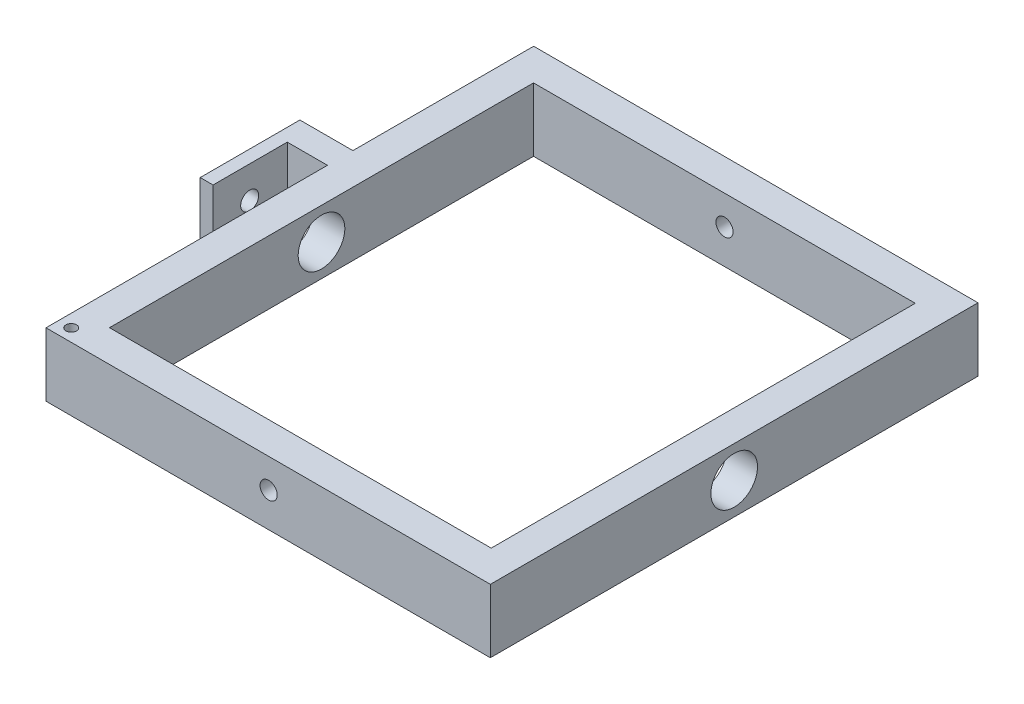
ISO-10303-21;
HEADER;
FILE_DESCRIPTION(('STEP AP214'),'2;1');
FILE_NAME('part.step','',(''),(''),'','','');
FILE_SCHEMA(('AUTOMOTIVE_DESIGN { 1 0 10303 214 1 1 1 1 }'));
ENDSEC;
DATA;
#1=APPLICATION_CONTEXT('core data for automotive mechanical design processes');
#2=APPLICATION_PROTOCOL_DEFINITION('international standard','automotive_design',2000,#1);
#3=PRODUCT_CONTEXT('',#1,'mechanical');
#4=PRODUCT('Part','Part','',(#3));
#5=PRODUCT_RELATED_PRODUCT_CATEGORY('part','',(#4));
#6=PRODUCT_DEFINITION_FORMATION('','',#4);
#7=PRODUCT_DEFINITION_CONTEXT('part definition',#1,'design');
#8=PRODUCT_DEFINITION('design','',#6,#7);
#9=PRODUCT_DEFINITION_SHAPE('','',#8);
#10=(LENGTH_UNIT() NAMED_UNIT(*) SI_UNIT(.MILLI.,.METRE.));
#11=(NAMED_UNIT(*) PLANE_ANGLE_UNIT() SI_UNIT($,.RADIAN.));
#12=(NAMED_UNIT(*) SI_UNIT($,.STERADIAN.) SOLID_ANGLE_UNIT());
#13=UNCERTAINTY_MEASURE_WITH_UNIT(LENGTH_MEASURE(1.E-05),#10,'distance_accuracy_value','');
#14=(GEOMETRIC_REPRESENTATION_CONTEXT(3) GLOBAL_UNCERTAINTY_ASSIGNED_CONTEXT((#13)) GLOBAL_UNIT_ASSIGNED_CONTEXT((#10,
#11,#12)) REPRESENTATION_CONTEXT('',''));
#15=CARTESIAN_POINT('',(0.,0.,0.));
#16=DIRECTION('',(0.,0.,1.));
#17=DIRECTION('',(1.,0.,0.));
#18=AXIS2_PLACEMENT_3D('',#15,#16,#17);
#19=CARTESIAN_POINT('',(-130.010419322355,30.,-17.7340118082441));
#20=DIRECTION('',(0.,0.,-1.));
#21=DIRECTION('',(0.,1.,0.));
#22=AXIS2_PLACEMENT_3D('',#19,#20,#21);
#23=PLANE('',#22);
#24=DIRECTION('',(1.,0.,0.));
#25=VECTOR('',#24,1.);
#26=CARTESIAN_POINT('',(-130.010419322355,30.,-17.7340118082441));
#27=LINE('',#26,#25);
#28=CARTESIAN_POINT('',(-123.949524665674,30.,-17.7340118082441));
#29=VERTEX_POINT('',#28);
#30=CARTESIAN_POINT('',(-105.010419322355,30.,-17.7340118082441));
#31=VERTEX_POINT('',#30);
#32=EDGE_CURVE('E134',#29,#31,#27,.T.);
#33=ORIENTED_EDGE('',*,*,#32,.F.);
#34=DIRECTION('',(0.,-1.,0.));
#35=VECTOR('',#34,1.);
#36=CARTESIAN_POINT('',(-123.949524665674,0.,-17.7340118082441));
#37=LINE('',#36,#35);
#38=CARTESIAN_POINT('',(-123.949524665674,0.,-17.7340118082441));
#39=VERTEX_POINT('',#38);
#40=EDGE_CURVE('E135',#29,#39,#37,.T.);
#41=ORIENTED_EDGE('',*,*,#40,.T.);
#42=DIRECTION('',(1.,0.,0.));
#43=VECTOR('',#42,1.);
#44=CARTESIAN_POINT('',(-130.010419322355,0.,-17.7340118082441));
#45=LINE('',#44,#43);
#46=CARTESIAN_POINT('',(-105.010419322355,0.,-17.7340118082441));
#47=VERTEX_POINT('',#46);
#48=EDGE_CURVE('E58',#39,#47,#45,.T.);
#49=ORIENTED_EDGE('',*,*,#48,.T.);
#50=DIRECTION('',(0.,1.,0.));
#51=VECTOR('',#50,1.);
#52=CARTESIAN_POINT('',(-105.010419322355,30.,-17.7340118082441));
#53=LINE('',#52,#51);
#54=EDGE_CURVE('E136',#47,#31,#53,.T.);
#55=ORIENTED_EDGE('',*,*,#54,.T.);
#56=EDGE_LOOP('',(#33,#41,#49,#55));
#57=FACE_BOUND('',#56,.T.);
#58=ADVANCED_FACE('F33',(#57),#23,.F.);
#59=CARTESIAN_POINT('',(-105.010419322355,30.,133.));
#60=DIRECTION('',(1.,0.,0.));
#61=DIRECTION('',(0.,0.,-1.));
#62=AXIS2_PLACEMENT_3D('',#59,#60,#61);
#63=PLANE('',#62);
#64=CARTESIAN_POINT('',(-105.010419322355,15.,0.));
#65=DIRECTION('',(1.,0.,0.));
#66=DIRECTION('',(0.,0.,-1.));
#67=AXIS2_PLACEMENT_3D('',#64,#65,#66);
#68=CIRCLE('',#67,11.);
#69=CARTESIAN_POINT('',(-105.010419322355,15.,11.));
#70=VERTEX_POINT('',#69);
#71=EDGE_CURVE('E192',#70,#70,#68,.F.);
#72=ORIENTED_EDGE('',*,*,#71,.F.);
#73=EDGE_LOOP('',(#72));
#74=FACE_BOUND('',#73,.T.);
#75=ORIENTED_EDGE('',*,*,#54,.F.);
#76=DIRECTION('',(0.,0.,-1.));
#77=VECTOR('',#76,1.);
#78=CARTESIAN_POINT('',(-105.010419322355,0.,133.));
#79=LINE('',#78,#77);
#80=CARTESIAN_POINT('',(-105.010419322355,0.,115.));
#81=VERTEX_POINT('',#80);
#82=EDGE_CURVE('E189',#81,#47,#79,.T.);
#83=ORIENTED_EDGE('',*,*,#82,.F.);
#84=DIRECTION('',(0.,-1.,0.));
#85=VECTOR('',#84,1.);
#86=CARTESIAN_POINT('',(-105.010419322355,30.,115.));
#87=LINE('',#86,#85);
#88=CARTESIAN_POINT('',(-105.010419322355,30.,115.));
#89=VERTEX_POINT('',#88);
#90=EDGE_CURVE('E196',#89,#81,#87,.T.);
#91=ORIENTED_EDGE('',*,*,#90,.F.);
#92=DIRECTION('',(0.,0.,-1.));
#93=VECTOR('',#92,1.);
#94=CARTESIAN_POINT('',(-105.010419322355,30.,133.));
#95=LINE('',#94,#93);
#96=EDGE_CURVE('E194',#89,#31,#95,.T.);
#97=ORIENTED_EDGE('',*,*,#96,.T.);
#98=EDGE_LOOP('',(#75,#83,#91,#97));
#99=FACE_BOUND('',#98,.T.);
#100=ADVANCED_FACE('F267',(#74,#99),#63,.F.);
#101=DIRECTION('',(0.,-1.,0.));
#102=VECTOR('',#101,1.);
#103=CARTESIAN_POINT('',(-105.010419322355,30.,-29.7394196250593));
#104=LINE('',#103,#102);
#105=CARTESIAN_POINT('',(-105.010419322355,30.,-29.7394196250593));
#106=VERTEX_POINT('',#105);
#107=CARTESIAN_POINT('',(-105.010419322355,0.,-29.7394196250593));
#108=VERTEX_POINT('',#107);
#109=EDGE_CURVE('E167',#106,#108,#104,.T.);
#110=ORIENTED_EDGE('',*,*,#109,.F.);
#111=CARTESIAN_POINT('',(-105.010419322355,30.,-115.));
#112=VERTEX_POINT('',#111);
#113=EDGE_CURVE('E188',#106,#112,#95,.T.);
#114=ORIENTED_EDGE('',*,*,#113,.T.);
#115=DIRECTION('',(0.,-1.,0.));
#116=VECTOR('',#115,1.);
#117=CARTESIAN_POINT('',(-105.010419322355,30.,-115.));
#118=LINE('',#117,#116);
#119=CARTESIAN_POINT('',(-105.010419322355,0.,-115.));
#120=VERTEX_POINT('',#119);
#121=EDGE_CURVE('E185',#112,#120,#118,.T.);
#122=ORIENTED_EDGE('',*,*,#121,.T.);
#123=EDGE_CURVE('E193',#108,#120,#79,.T.);
#124=ORIENTED_EDGE('',*,*,#123,.F.);
#125=EDGE_LOOP('',(#110,#114,#122,#124));
#126=FACE_BOUND('',#125,.T.);
#127=ADVANCED_FACE('F270',(#126),#63,.F.);
#128=CARTESIAN_POINT('',(-100.,30.,-100.));
#129=DIRECTION('',(0.,0.,1.));
#130=DIRECTION('',(1.,0.,0.));
#131=AXIS2_PLACEMENT_3D('',#128,#129,#130);
#132=PLANE('',#131);
#133=CARTESIAN_POINT('',(0.,16.1759191137221,-100.));
#134=DIRECTION('',(0.,0.,1.));
#135=DIRECTION('',(1.,0.,0.));
#136=AXIS2_PLACEMENT_3D('',#133,#134,#135);
#137=CIRCLE('',#136,4.04669054587853);
#138=CARTESIAN_POINT('',(4.04669054587853,16.1759191137221,-100.));
#139=VERTEX_POINT('',#138);
#140=EDGE_CURVE('E237',#139,#139,#137,.T.);
#141=ORIENTED_EDGE('',*,*,#140,.F.);
#142=EDGE_LOOP('',(#141));
#143=FACE_BOUND('',#142,.T.);
#144=DIRECTION('',(-1.,0.,0.));
#145=VECTOR('',#144,1.);
#146=CARTESIAN_POINT('',(-100.,30.,-100.));
#147=LINE('',#146,#145);
#148=CARTESIAN_POINT('',(89.971534855998,30.,-100.));
#149=VERTEX_POINT('',#148);
#150=CARTESIAN_POINT('',(-90.0799985312162,30.,-100.));
#151=VERTEX_POINT('',#150);
#152=EDGE_CURVE('E244',#149,#151,#147,.T.);
#153=ORIENTED_EDGE('',*,*,#152,.T.);
#154=DIRECTION('',(0.,-1.,0.));
#155=VECTOR('',#154,1.);
#156=CARTESIAN_POINT('',(-90.0799985312162,30.,-100.));
#157=LINE('',#156,#155);
#158=CARTESIAN_POINT('',(-90.0799985312162,0.,-100.));
#159=VERTEX_POINT('',#158);
#160=EDGE_CURVE('E219',#151,#159,#157,.T.);
#161=ORIENTED_EDGE('',*,*,#160,.T.);
#162=DIRECTION('',(-1.,0.,0.));
#163=VECTOR('',#162,1.);
#164=CARTESIAN_POINT('',(-100.,0.,-100.));
#165=LINE('',#164,#163);
#166=CARTESIAN_POINT('',(89.971534855998,0.,-100.));
#167=VERTEX_POINT('',#166);
#168=EDGE_CURVE('E243',#167,#159,#165,.T.);
#169=ORIENTED_EDGE('',*,*,#168,.F.);
#170=DIRECTION('',(0.,1.,0.));
#171=VECTOR('',#170,1.);
#172=CARTESIAN_POINT('',(89.971534855998,30.,-100.));
#173=LINE('',#172,#171);
#174=EDGE_CURVE('E231',#167,#149,#173,.T.);
#175=ORIENTED_EDGE('',*,*,#174,.T.);
#176=EDGE_LOOP('',(#153,#161,#169,#175));
#177=FACE_BOUND('',#176,.T.);
#178=ADVANCED_FACE('F358',(#143,#177),#132,.T.);
#179=CARTESIAN_POINT('',(-100.,30.,100.));
#180=DIRECTION('',(0.,0.,-1.));
#181=DIRECTION('',(-1.,0.,0.));
#182=AXIS2_PLACEMENT_3D('',#179,#180,#181);
#183=PLANE('',#182);
#184=CARTESIAN_POINT('',(0.,16.1759191137221,100.));
#185=DIRECTION('',(0.,0.,-1.));
#186=DIRECTION('',(-1.,0.,0.));
#187=AXIS2_PLACEMENT_3D('',#184,#185,#186);
#188=CIRCLE('',#187,4.04669054587853);
#189=CARTESIAN_POINT('',(-4.04669054587853,16.1759191137221,100.));
#190=VERTEX_POINT('',#189);
#191=EDGE_CURVE('E236',#190,#190,#188,.T.);
#192=ORIENTED_EDGE('',*,*,#191,.F.);
#193=EDGE_LOOP('',(#192));
#194=FACE_BOUND('',#193,.T.);
#195=DIRECTION('',(1.,0.,0.));
#196=VECTOR('',#195,1.);
#197=CARTESIAN_POINT('',(-100.,0.,100.));
#198=LINE('',#197,#196);
#199=CARTESIAN_POINT('',(-90.0799985312162,0.,100.));
#200=VERTEX_POINT('',#199);
#201=CARTESIAN_POINT('',(89.971534855998,0.,100.));
#202=VERTEX_POINT('',#201);
#203=EDGE_CURVE('E248',#200,#202,#198,.T.);
#204=ORIENTED_EDGE('',*,*,#203,.F.);
#205=DIRECTION('',(0.,-1.,0.));
#206=VECTOR('',#205,1.);
#207=CARTESIAN_POINT('',(-90.0799985312162,30.,100.));
#208=LINE('',#207,#206);
#209=CARTESIAN_POINT('',(-90.0799985312162,30.,100.));
#210=VERTEX_POINT('',#209);
#211=EDGE_CURVE('E212',#210,#200,#208,.T.);
#212=ORIENTED_EDGE('',*,*,#211,.F.);
#213=DIRECTION('',(1.,0.,0.));
#214=VECTOR('',#213,1.);
#215=CARTESIAN_POINT('',(-100.,30.,100.));
#216=LINE('',#215,#214);
#217=CARTESIAN_POINT('',(89.971534855998,30.,100.));
#218=VERTEX_POINT('',#217);
#219=EDGE_CURVE('E247',#210,#218,#216,.T.);
#220=ORIENTED_EDGE('',*,*,#219,.T.);
#221=DIRECTION('',(0.,1.,0.));
#222=VECTOR('',#221,1.);
#223=CARTESIAN_POINT('',(89.971534855998,30.,100.));
#224=LINE('',#223,#222);
#225=EDGE_CURVE('E222',#202,#218,#224,.T.);
#226=ORIENTED_EDGE('',*,*,#225,.F.);
#227=EDGE_LOOP('',(#204,#212,#220,#226));
#228=FACE_BOUND('',#227,.T.);
#229=ADVANCED_FACE('F325',(#194,#228),#183,.T.);
#230=CARTESIAN_POINT('',(0.,30.,0.));
#231=DIRECTION('',(0.,-1.,0.));
#232=DIRECTION('',(0.,0.,-1.));
#233=AXIS2_PLACEMENT_3D('',#230,#231,#232);
#234=PLANE('',#233);
#235=CARTESIAN_POINT('',(-99.0236424460562,30.,109.086175653123));
#236=DIRECTION('',(0.,-1.,0.));
#237=DIRECTION('',(0.,0.,-1.));
#238=AXIS2_PLACEMENT_3D('',#235,#236,#237);
#239=CIRCLE('',#238,2.5);
#240=CARTESIAN_POINT('',(-99.0236424460562,30.,106.586175653123));
#241=VERTEX_POINT('',#240);
#242=EDGE_CURVE('E308',#241,#241,#239,.T.);
#243=ORIENTED_EDGE('',*,*,#242,.T.);
#244=EDGE_LOOP('',(#243));
#245=FACE_BOUND('',#244,.T.);
#246=DIRECTION('',(0.,0.,1.));
#247=VECTOR('',#246,1.);
#248=CARTESIAN_POINT('',(-90.0799985312162,30.,-103.));
#249=LINE('',#248,#247);
#250=EDGE_CURVE('E217',#151,#210,#249,.T.);
#251=ORIENTED_EDGE('',*,*,#250,.F.);
#252=ORIENTED_EDGE('',*,*,#152,.F.);
#253=DIRECTION('',(0.,0.,1.));
#254=VECTOR('',#253,1.);
#255=CARTESIAN_POINT('',(89.971534855998,30.,-103.));
#256=LINE('',#255,#254);
#257=EDGE_CURVE('E225',#149,#218,#256,.T.);
#258=ORIENTED_EDGE('',*,*,#257,.T.);
#259=ORIENTED_EDGE('',*,*,#219,.F.);
#260=EDGE_LOOP('',(#251,#252,#258,#259));
#261=FACE_BOUND('',#260,.T.);
#262=DIRECTION('',(-1.,0.,0.));
#263=VECTOR('',#262,1.);
#264=CARTESIAN_POINT('',(-130.010419322355,30.,17.265988191756));
#265=LINE('',#264,#263);
#266=CARTESIAN_POINT('',(-123.949524665674,30.,17.265988191756));
#267=VERTEX_POINT('',#266);
#268=CARTESIAN_POINT('',(-130.010419322355,30.,17.265988191756));
#269=VERTEX_POINT('',#268);
#270=EDGE_CURVE('E152',#267,#269,#265,.T.);
#271=ORIENTED_EDGE('',*,*,#270,.F.);
#272=DIRECTION('',(0.,0.,1.));
#273=VECTOR('',#272,1.);
#274=CARTESIAN_POINT('',(-123.949524665674,30.,-17.7340118082441));
#275=LINE('',#274,#273);
#276=EDGE_CURVE('E50',#29,#267,#275,.T.);
#277=ORIENTED_EDGE('',*,*,#276,.F.);
#278=ORIENTED_EDGE('',*,*,#32,.T.);
#279=ORIENTED_EDGE('',*,*,#96,.F.);
#280=DIRECTION('',(1.,0.,0.));
#281=VECTOR('',#280,1.);
#282=CARTESIAN_POINT('',(-115.,30.,115.));
#283=LINE('',#282,#281);
#284=CARTESIAN_POINT('',(104.558967665568,30.,115.));
#285=VERTEX_POINT('',#284);
#286=EDGE_CURVE('E11',#89,#285,#283,.T.);
#287=ORIENTED_EDGE('',*,*,#286,.T.);
#288=DIRECTION('',(0.,0.,-1.));
#289=VECTOR('',#288,1.);
#290=CARTESIAN_POINT('',(104.558967665568,30.,163.));
#291=LINE('',#290,#289);
#292=CARTESIAN_POINT('',(104.558967665568,30.,-115.));
#293=VERTEX_POINT('',#292);
#294=EDGE_CURVE('E202',#285,#293,#291,.T.);
#295=ORIENTED_EDGE('',*,*,#294,.T.);
#296=DIRECTION('',(-1.,0.,0.));
#297=VECTOR('',#296,1.);
#298=CARTESIAN_POINT('',(-115.,30.,-115.));
#299=LINE('',#298,#297);
#300=EDGE_CURVE('E42',#293,#112,#299,.T.);
#301=ORIENTED_EDGE('',*,*,#300,.T.);
#302=ORIENTED_EDGE('',*,*,#113,.F.);
#303=DIRECTION('',(1.,0.,0.));
#304=VECTOR('',#303,1.);
#305=CARTESIAN_POINT('',(-130.010419322355,30.,-29.7394196250593));
#306=LINE('',#305,#304);
#307=CARTESIAN_POINT('',(-130.010419322355,30.,-29.7394196250593));
#308=VERTEX_POINT('',#307);
#309=EDGE_CURVE('E141',#308,#106,#306,.T.);
#310=ORIENTED_EDGE('',*,*,#309,.F.);
#311=DIRECTION('',(0.,0.,-1.));
#312=VECTOR('',#311,1.);
#313=CARTESIAN_POINT('',(-130.010419322355,30.,-17.7340118082441));
#314=LINE('',#313,#312);
#315=EDGE_CURVE('E164',#269,#308,#314,.T.);
#316=ORIENTED_EDGE('',*,*,#315,.F.);
#317=EDGE_LOOP('',(#271,#277,#278,#279,#287,#295,#301,#302,#310,#316));
#318=FACE_BOUND('',#317,.T.);
#319=ADVANCED_FACE('F150',(#245,#261,#318),#234,.F.);
#320=CARTESIAN_POINT('',(0.,0.,0.));
#321=DIRECTION('',(0.,-1.,0.));
#322=DIRECTION('',(0.,0.,-1.));
#323=AXIS2_PLACEMENT_3D('',#320,#321,#322);
#324=PLANE('',#323);
#325=CARTESIAN_POINT('',(-99.0236424460562,0.,109.086175653123));
#326=DIRECTION('',(0.,-1.,0.));
#327=DIRECTION('',(0.,0.,-1.));
#328=AXIS2_PLACEMENT_3D('',#325,#326,#327);
#329=CIRCLE('',#328,2.5);
#330=CARTESIAN_POINT('',(-99.0236424460562,0.,106.586175653123));
#331=VERTEX_POINT('',#330);
#332=EDGE_CURVE('E311',#331,#331,#329,.T.);
#333=ORIENTED_EDGE('',*,*,#332,.F.);
#334=EDGE_LOOP('',(#333));
#335=FACE_BOUND('',#334,.T.);
#336=DIRECTION('',(0.,0.,1.));
#337=VECTOR('',#336,1.);
#338=CARTESIAN_POINT('',(-123.949524665674,0.,-17.7340118082441));
#339=LINE('',#338,#337);
#340=CARTESIAN_POINT('',(-123.949524665674,0.,17.265988191756));
#341=VERTEX_POINT('',#340);
#342=EDGE_CURVE('E146',#39,#341,#339,.T.);
#343=ORIENTED_EDGE('',*,*,#342,.T.);
#344=DIRECTION('',(1.,0.,0.));
#345=VECTOR('',#344,1.);
#346=CARTESIAN_POINT('',(-130.010419322355,0.,17.265988191756));
#347=LINE('',#346,#345);
#348=CARTESIAN_POINT('',(-130.010419322355,0.,17.265988191756));
#349=VERTEX_POINT('',#348);
#350=EDGE_CURVE('E160',#349,#341,#347,.T.);
#351=ORIENTED_EDGE('',*,*,#350,.F.);
#352=DIRECTION('',(0.,0.,1.));
#353=VECTOR('',#352,1.);
#354=CARTESIAN_POINT('',(-130.010419322355,0.,-17.7340118082441));
#355=LINE('',#354,#353);
#356=CARTESIAN_POINT('',(-130.010419322355,0.,-29.7394196250593));
#357=VERTEX_POINT('',#356);
#358=EDGE_CURVE('E169',#357,#349,#355,.T.);
#359=ORIENTED_EDGE('',*,*,#358,.F.);
#360=DIRECTION('',(1.,0.,0.));
#361=VECTOR('',#360,1.);
#362=CARTESIAN_POINT('',(-130.010419322355,0.,-29.7394196250593));
#363=LINE('',#362,#361);
#364=EDGE_CURVE('E175',#357,#108,#363,.T.);
#365=ORIENTED_EDGE('',*,*,#364,.T.);
#366=ORIENTED_EDGE('',*,*,#123,.T.);
#367=DIRECTION('',(-1.,0.,0.));
#368=VECTOR('',#367,1.);
#369=CARTESIAN_POINT('',(-115.,0.,-115.));
#370=LINE('',#369,#368);
#371=CARTESIAN_POINT('',(104.558967665568,0.,-115.));
#372=VERTEX_POINT('',#371);
#373=EDGE_CURVE('E250',#372,#120,#370,.T.);
#374=ORIENTED_EDGE('',*,*,#373,.F.);
#375=DIRECTION('',(0.,0.,-1.));
#376=VECTOR('',#375,1.);
#377=CARTESIAN_POINT('',(104.558967665568,0.,163.));
#378=LINE('',#377,#376);
#379=CARTESIAN_POINT('',(104.558967665568,0.,115.));
#380=VERTEX_POINT('',#379);
#381=EDGE_CURVE('E201',#380,#372,#378,.T.);
#382=ORIENTED_EDGE('',*,*,#381,.F.);
#383=DIRECTION('',(1.,0.,0.));
#384=VECTOR('',#383,1.);
#385=CARTESIAN_POINT('',(-115.,0.,115.));
#386=LINE('',#385,#384);
#387=EDGE_CURVE('E255',#81,#380,#386,.T.);
#388=ORIENTED_EDGE('',*,*,#387,.F.);
#389=ORIENTED_EDGE('',*,*,#82,.T.);
#390=ORIENTED_EDGE('',*,*,#48,.F.);
#391=EDGE_LOOP('',(#343,#351,#359,#365,#366,#374,#382,#388,#389,#390));
#392=FACE_BOUND('',#391,.T.);
#393=ORIENTED_EDGE('',*,*,#168,.T.);
#394=DIRECTION('',(0.,0.,1.));
#395=VECTOR('',#394,1.);
#396=CARTESIAN_POINT('',(-90.0799985312162,0.,-103.));
#397=LINE('',#396,#395);
#398=EDGE_CURVE('E215',#159,#200,#397,.T.);
#399=ORIENTED_EDGE('',*,*,#398,.T.);
#400=ORIENTED_EDGE('',*,*,#203,.T.);
#401=DIRECTION('',(0.,0.,1.));
#402=VECTOR('',#401,1.);
#403=CARTESIAN_POINT('',(89.971534855998,0.,-103.));
#404=LINE('',#403,#402);
#405=EDGE_CURVE('E228',#167,#202,#404,.T.);
#406=ORIENTED_EDGE('',*,*,#405,.F.);
#407=EDGE_LOOP('',(#393,#399,#400,#406));
#408=FACE_BOUND('',#407,.T.);
#409=ADVANCED_FACE('F274',(#335,#392,#408),#324,.T.);
#410=CARTESIAN_POINT('',(-115.,30.,-115.));
#411=DIRECTION('',(0.,0.,1.));
#412=DIRECTION('',(1.,0.,0.));
#413=AXIS2_PLACEMENT_3D('',#410,#411,#412);
#414=PLANE('',#413);
#415=CARTESIAN_POINT('',(0.,16.1759191137221,-115.));
#416=DIRECTION('',(0.,0.,1.));
#417=DIRECTION('',(1.,0.,0.));
#418=AXIS2_PLACEMENT_3D('',#415,#416,#417);
#419=CIRCLE('',#418,4.04669054587853);
#420=CARTESIAN_POINT('',(4.04669054587853,16.1759191137221,-115.));
#421=VERTEX_POINT('',#420);
#422=EDGE_CURVE('E240',#421,#421,#419,.T.);
#423=ORIENTED_EDGE('',*,*,#422,.T.);
#424=EDGE_LOOP('',(#423));
#425=FACE_BOUND('',#424,.T.);
#426=ORIENTED_EDGE('',*,*,#373,.T.);
#427=ORIENTED_EDGE('',*,*,#121,.F.);
#428=ORIENTED_EDGE('',*,*,#300,.F.);
#429=DIRECTION('',(0.,1.,0.));
#430=VECTOR('',#429,1.);
#431=CARTESIAN_POINT('',(104.558967665568,0.,-115.));
#432=LINE('',#431,#430);
#433=EDGE_CURVE('E199',#372,#293,#432,.T.);
#434=ORIENTED_EDGE('',*,*,#433,.F.);
#435=EDGE_LOOP('',(#426,#427,#428,#434));
#436=FACE_BOUND('',#435,.T.);
#437=ADVANCED_FACE('F35',(#425,#436),#414,.F.);
#438=CARTESIAN_POINT('',(-115.,30.,115.));
#439=DIRECTION('',(0.,0.,-1.));
#440=DIRECTION('',(-1.,0.,0.));
#441=AXIS2_PLACEMENT_3D('',#438,#439,#440);
#442=PLANE('',#441);
#443=CARTESIAN_POINT('',(0.,16.1759191137221,115.));
#444=DIRECTION('',(0.,0.,1.));
#445=DIRECTION('',(1.,0.,0.));
#446=AXIS2_PLACEMENT_3D('',#443,#444,#445);
#447=CIRCLE('',#446,4.04669054587853);
#448=CARTESIAN_POINT('',(4.04669054587853,16.1759191137221,115.));
#449=VERTEX_POINT('',#448);
#450=EDGE_CURVE('E233',#449,#449,#447,.T.);
#451=ORIENTED_EDGE('',*,*,#450,.F.);
#452=EDGE_LOOP('',(#451));
#453=FACE_BOUND('',#452,.T.);
#454=ORIENTED_EDGE('',*,*,#286,.F.);
#455=ORIENTED_EDGE('',*,*,#90,.T.);
#456=ORIENTED_EDGE('',*,*,#387,.T.);
#457=DIRECTION('',(0.,1.,0.));
#458=VECTOR('',#457,1.);
#459=CARTESIAN_POINT('',(104.558967665568,30.,115.));
#460=LINE('',#459,#458);
#461=EDGE_CURVE('E205',#380,#285,#460,.T.);
#462=ORIENTED_EDGE('',*,*,#461,.T.);
#463=EDGE_LOOP('',(#454,#455,#456,#462));
#464=FACE_BOUND('',#463,.T.);
#465=ADVANCED_FACE('F281',(#453,#464),#442,.F.);
#466=CARTESIAN_POINT('',(0.,16.1759191137221,-165.));
#467=DIRECTION('',(0.,0.,1.));
#468=DIRECTION('',(1.,0.,0.));
#469=AXIS2_PLACEMENT_3D('',#466,#467,#468);
#470=CYLINDRICAL_SURFACE('',#469,4.04669054587853);
#471=ORIENTED_EDGE('',*,*,#191,.T.);
#472=EDGE_LOOP('',(#471));
#473=FACE_BOUND('',#472,.T.);
#474=ORIENTED_EDGE('',*,*,#450,.T.);
#475=EDGE_LOOP('',(#474));
#476=FACE_BOUND('',#475,.T.);
#477=ADVANCED_FACE('F349',(#473,#476),#470,.F.);
#478=ORIENTED_EDGE('',*,*,#140,.T.);
#479=EDGE_LOOP('',(#478));
#480=FACE_BOUND('',#479,.T.);
#481=ORIENTED_EDGE('',*,*,#422,.F.);
#482=EDGE_LOOP('',(#481));
#483=FACE_BOUND('',#482,.T.);
#484=ADVANCED_FACE('F345',(#480,#483),#470,.F.);
#485=CARTESIAN_POINT('',(89.971534855998,30.,-103.));
#486=DIRECTION('',(1.,0.,0.));
#487=DIRECTION('',(0.,0.,-1.));
#488=AXIS2_PLACEMENT_3D('',#485,#486,#487);
#489=PLANE('',#488);
#490=CARTESIAN_POINT('',(89.971534855998,15.,0.));
#491=DIRECTION('',(1.,0.,0.));
#492=DIRECTION('',(0.,0.,-1.));
#493=AXIS2_PLACEMENT_3D('',#490,#491,#492);
#494=CIRCLE('',#493,11.);
#495=CARTESIAN_POINT('',(89.971534855998,15.,-11.));
#496=VERTEX_POINT('',#495);
#497=EDGE_CURVE('E182',#496,#496,#494,.T.);
#498=ORIENTED_EDGE('',*,*,#497,.T.);
#499=EDGE_LOOP('',(#498));
#500=FACE_BOUND('',#499,.T.);
#501=ORIENTED_EDGE('',*,*,#174,.F.);
#502=ORIENTED_EDGE('',*,*,#405,.T.);
#503=ORIENTED_EDGE('',*,*,#225,.T.);
#504=ORIENTED_EDGE('',*,*,#257,.F.);
#505=EDGE_LOOP('',(#501,#502,#503,#504));
#506=FACE_BOUND('',#505,.T.);
#507=ADVANCED_FACE('F341',(#500,#506),#489,.F.);
#508=CARTESIAN_POINT('',(-90.0799985312162,30.,-103.));
#509=DIRECTION('',(-1.,0.,0.));
#510=DIRECTION('',(0.,0.,1.));
#511=AXIS2_PLACEMENT_3D('',#508,#509,#510);
#512=PLANE('',#511);
#513=CARTESIAN_POINT('',(-90.0799985312162,15.,0.));
#514=DIRECTION('',(-1.,0.,0.));
#515=DIRECTION('',(0.,0.,1.));
#516=AXIS2_PLACEMENT_3D('',#513,#514,#515);
#517=CIRCLE('',#516,11.);
#518=CARTESIAN_POINT('',(-90.0799985312162,15.,11.));
#519=VERTEX_POINT('',#518);
#520=EDGE_CURVE('E140',#519,#519,#517,.T.);
#521=ORIENTED_EDGE('',*,*,#520,.T.);
#522=EDGE_LOOP('',(#521));
#523=FACE_BOUND('',#522,.T.);
#524=ORIENTED_EDGE('',*,*,#160,.F.);
#525=ORIENTED_EDGE('',*,*,#250,.T.);
#526=ORIENTED_EDGE('',*,*,#211,.T.);
#527=ORIENTED_EDGE('',*,*,#398,.F.);
#528=EDGE_LOOP('',(#524,#525,#526,#527));
#529=FACE_BOUND('',#528,.T.);
#530=ADVANCED_FACE('F338',(#523,#529),#512,.F.);
#531=CARTESIAN_POINT('',(104.558967665568,0.,163.));
#532=DIRECTION('',(-1.,0.,0.));
#533=DIRECTION('',(0.,0.,1.));
#534=AXIS2_PLACEMENT_3D('',#531,#532,#533);
#535=PLANE('',#534);
#536=ORIENTED_EDGE('',*,*,#381,.T.);
#537=ORIENTED_EDGE('',*,*,#433,.T.);
#538=ORIENTED_EDGE('',*,*,#294,.F.);
#539=ORIENTED_EDGE('',*,*,#461,.F.);
#540=EDGE_LOOP('',(#536,#537,#538,#539));
#541=FACE_BOUND('',#540,.T.);
#542=CARTESIAN_POINT('',(104.558967665568,15.,0.));
#543=DIRECTION('',(-1.,0.,0.));
#544=DIRECTION('',(0.,0.,1.));
#545=AXIS2_PLACEMENT_3D('',#542,#543,#544);
#546=CIRCLE('',#545,11.);
#547=CARTESIAN_POINT('',(104.558967665568,15.,11.));
#548=VERTEX_POINT('',#547);
#549=EDGE_CURVE('E209',#548,#548,#546,.F.);
#550=ORIENTED_EDGE('',*,*,#549,.F.);
#551=EDGE_LOOP('',(#550));
#552=FACE_BOUND('',#551,.T.);
#553=ADVANCED_FACE('F284',(#541,#552),#535,.F.);
#554=CARTESIAN_POINT('',(-91.0000000000001,15.,0.));
#555=DIRECTION('',(1.,0.,0.));
#556=DIRECTION('',(0.,0.,-1.));
#557=AXIS2_PLACEMENT_3D('',#554,#555,#556);
#558=CYLINDRICAL_SURFACE('',#557,11.);
#559=ORIENTED_EDGE('',*,*,#549,.T.);
#560=EDGE_LOOP('',(#559));
#561=FACE_BOUND('',#560,.T.);
#562=ORIENTED_EDGE('',*,*,#497,.F.);
#563=EDGE_LOOP('',(#562));
#564=FACE_BOUND('',#563,.T.);
#565=ADVANCED_FACE('F337',(#561,#564),#558,.F.);
#566=CARTESIAN_POINT('',(115.,15.,0.));
#567=DIRECTION('',(-1.,0.,0.));
#568=DIRECTION('',(0.,0.,1.));
#569=AXIS2_PLACEMENT_3D('',#566,#567,#568);
#570=CYLINDRICAL_SURFACE('',#569,11.);
#571=CARTESIAN_POINT('',(-105.010419322355,15.,11.));
#572=CARTESIAN_POINT('',(-104.85489410578,15.,11.));
#573=CARTESIAN_POINT('',(-104.699368889206,15.,11.));
#574=CARTESIAN_POINT('',(-104.388318456057,15.,11.));
#575=CARTESIAN_POINT('',(-104.232793239483,15.,11.));
#576=CARTESIAN_POINT('',(-103.921742806334,15.,11.));
#577=CARTESIAN_POINT('',(-103.76621758976,15.,11.));
#578=CARTESIAN_POINT('',(-103.455167156611,15.,11.));
#579=CARTESIAN_POINT('',(-103.299641940037,15.,11.));
#580=CARTESIAN_POINT('',(-102.988591506888,15.,11.));
#581=CARTESIAN_POINT('',(-102.833066290314,15.,11.));
#582=CARTESIAN_POINT('',(-102.522015857165,15.,11.));
#583=CARTESIAN_POINT('',(-102.366490640591,15.,11.));
#584=CARTESIAN_POINT('',(-102.055440207442,15.,11.));
#585=CARTESIAN_POINT('',(-101.899914990867,15.,11.));
#586=CARTESIAN_POINT('',(-101.588864557719,15.,11.));
#587=CARTESIAN_POINT('',(-101.433339341144,15.,11.));
#588=CARTESIAN_POINT('',(-101.122288907996,15.,11.));
#589=CARTESIAN_POINT('',(-100.966763691421,15.,11.));
#590=CARTESIAN_POINT('',(-100.655713258273,15.,11.));
#591=CARTESIAN_POINT('',(-100.500188041698,15.,11.));
#592=CARTESIAN_POINT('',(-100.18913760855,15.,11.));
#593=CARTESIAN_POINT('',(-100.033612391975,15.,11.));
#594=CARTESIAN_POINT('',(-99.7225619588264,15.,11.));
#595=CARTESIAN_POINT('',(-99.5670367422521,15.,11.));
#596=CARTESIAN_POINT('',(-99.2559863091034,15.,11.));
#597=CARTESIAN_POINT('',(-99.100461092529,15.,11.));
#598=CARTESIAN_POINT('',(-98.7894106593803,15.,11.));
#599=CARTESIAN_POINT('',(-98.6338854428059,15.,11.));
#600=CARTESIAN_POINT('',(-98.3228350096572,15.,11.));
#601=CARTESIAN_POINT('',(-98.1673097930829,15.,11.));
#602=CARTESIAN_POINT('',(-97.8562593599341,15.,11.));
#603=CARTESIAN_POINT('',(-97.7007341433598,15.,11.));
#604=CARTESIAN_POINT('',(-97.3896837102111,15.,11.));
#605=CARTESIAN_POINT('',(-97.2341584936367,15.,11.));
#606=CARTESIAN_POINT('',(-96.923108060488,15.,11.));
#607=CARTESIAN_POINT('',(-96.7675828439136,15.,11.));
#608=CARTESIAN_POINT('',(-96.4565324107649,15.,11.));
#609=CARTESIAN_POINT('',(-96.3010071941905,15.,11.));
#610=CARTESIAN_POINT('',(-95.9899567610418,15.,11.));
#611=CARTESIAN_POINT('',(-95.8344315444675,15.,11.));
#612=CARTESIAN_POINT('',(-95.5233811113188,15.,11.));
#613=CARTESIAN_POINT('',(-95.3678558947444,15.,11.));
#614=CARTESIAN_POINT('',(-95.0568054615957,15.,11.));
#615=CARTESIAN_POINT('',(-94.9012802450213,15.,11.));
#616=CARTESIAN_POINT('',(-94.5902298118726,15.,11.));
#617=CARTESIAN_POINT('',(-94.4347045952982,15.,11.));
#618=CARTESIAN_POINT('',(-94.1236541621495,15.,11.));
#619=CARTESIAN_POINT('',(-93.9681289455752,15.,11.));
#620=CARTESIAN_POINT('',(-93.6570785124264,15.,11.));
#621=CARTESIAN_POINT('',(-93.5015532958521,15.,11.));
#622=CARTESIAN_POINT('',(-93.1905028627034,15.,11.));
#623=CARTESIAN_POINT('',(-93.034977646129,15.,11.));
#624=CARTESIAN_POINT('',(-92.7239272129803,15.,11.));
#625=CARTESIAN_POINT('',(-92.5684019964059,15.,11.));
#626=CARTESIAN_POINT('',(-92.2573515632572,15.,11.));
#627=CARTESIAN_POINT('',(-92.1018263466828,15.,11.));
#628=CARTESIAN_POINT('',(-91.7907759135341,15.,11.));
#629=CARTESIAN_POINT('',(-91.6352506969598,15.,11.));
#630=CARTESIAN_POINT('',(-91.3242002638111,15.,11.));
#631=CARTESIAN_POINT('',(-91.1686750472367,15.,11.));
#632=CARTESIAN_POINT('',(-90.857624614088,15.,11.));
#633=CARTESIAN_POINT('',(-90.7020993975136,15.,11.));
#634=CARTESIAN_POINT('',(-90.3910489643649,15.,11.));
#635=CARTESIAN_POINT('',(-90.2355237477905,15.,11.));
#636=CARTESIAN_POINT('',(-90.0799985312162,15.,11.));
#637=B_SPLINE_CURVE_WITH_KNOTS('',3,(#571,#572,#573,#574,#575,#576,#577,#578,#579,#580,#581,
#582,#583,#584,#585,#586,#587,#588,#589,#590,#591,#592,#593,#594,#595,#596,#597,#598,#599,#600,
#601,#602,#603,#604,#605,#606,#607,#608,#609,#610,#611,#612,#613,#614,#615,#616,#617,#618,#619,
#620,#621,#622,#623,#624,#625,#626,#627,#628,#629,#630,#631,#632,#633,#634,#635,#636),
.UNSPECIFIED.,.F.,.F.,(4,2,2,2,2,2,2,2,2,2,2,2,2,2,2,2,2,2,2,2,2,2,2,2,2,2,2,2,2,2,2,2,4),(0.,
0.466575649723078,0.933151299446155,1.39972694916923,1.86630259889231,2.33287824861539,
2.79945389833847,3.26602954806154,3.73260519778462,4.1991808475077,4.66575649723078,
5.13233214695386,5.59890779667693,6.06548344640001,6.53205909612309,6.99863474584617,
7.46521039556924,7.93178604529232,8.3983616950154,8.86493734473848,9.33151299446155,
9.79808864418463,10.2646642939077,10.7312399436308,11.1978155933539,11.6643912430769,
12.1309668928,12.5975425425231,13.0641181922462,13.5306938419693,13.9972694916923,
14.4638451414154,14.9304207911385),.UNSPECIFIED.);
#638=EDGE_CURVE('BSEAM264',#70,#519,#637,.T.);
#639=ORIENTED_EDGE('',*,*,#71,.T.);
#640=ORIENTED_EDGE('',*,*,#520,.F.);
#641=ORIENTED_EDGE('',*,*,#638,.T.);
#642=ORIENTED_EDGE('',*,*,#638,.F.);
#643=EDGE_LOOP('',(#639,#641,#640,#642));
#644=FACE_BOUND('',#643,.T.);
#645=ADVANCED_FACE('F264',(#644),#570,.F.);
#646=CARTESIAN_POINT('',(-130.010419322355,30.,-29.7394196250593));
#647=DIRECTION('',(0.,0.,1.));
#648=DIRECTION('',(0.,-1.,0.));
#649=AXIS2_PLACEMENT_3D('',#646,#647,#648);
#650=PLANE('',#649);
#651=ORIENTED_EDGE('',*,*,#109,.T.);
#652=ORIENTED_EDGE('',*,*,#364,.F.);
#653=DIRECTION('',(0.,-1.,0.));
#654=VECTOR('',#653,1.);
#655=CARTESIAN_POINT('',(-130.010419322355,30.,-29.7394196250593));
#656=LINE('',#655,#654);
#657=EDGE_CURVE('E166',#308,#357,#656,.T.);
#658=ORIENTED_EDGE('',*,*,#657,.F.);
#659=ORIENTED_EDGE('',*,*,#309,.T.);
#660=EDGE_LOOP('',(#651,#652,#658,#659));
#661=FACE_BOUND('',#660,.T.);
#662=ADVANCED_FACE('F295',(#661),#650,.F.);
#663=CARTESIAN_POINT('',(-130.010419322355,0.,0.));
#664=DIRECTION('',(1.,0.,0.));
#665=DIRECTION('',(0.,0.,-1.));
#666=AXIS2_PLACEMENT_3D('',#663,#664,#665);
#667=PLANE('',#666);
#668=CARTESIAN_POINT('',(-130.010419322355,15.,0.));
#669=DIRECTION('',(1.,0.,0.));
#670=DIRECTION('',(0.,0.,-1.));
#671=AXIS2_PLACEMENT_3D('',#668,#669,#670);
#672=CIRCLE('',#671,4.25);
#673=CARTESIAN_POINT('',(-130.010419322355,15.,-4.25));
#674=VERTEX_POINT('',#673);
#675=EDGE_CURVE('E304',#674,#674,#672,.T.);
#676=ORIENTED_EDGE('',*,*,#675,.T.);
#677=EDGE_LOOP('',(#676));
#678=FACE_BOUND('',#677,.T.);
#679=ORIENTED_EDGE('',*,*,#358,.T.);
#680=DIRECTION('',(0.,-1.,0.));
#681=VECTOR('',#680,1.);
#682=CARTESIAN_POINT('',(-130.010419322355,0.,17.265988191756));
#683=LINE('',#682,#681);
#684=EDGE_CURVE('E154',#269,#349,#683,.T.);
#685=ORIENTED_EDGE('',*,*,#684,.F.);
#686=ORIENTED_EDGE('',*,*,#315,.T.);
#687=ORIENTED_EDGE('',*,*,#657,.T.);
#688=EDGE_LOOP('',(#679,#685,#686,#687));
#689=FACE_BOUND('',#688,.T.);
#690=ADVANCED_FACE('F299',(#678,#689),#667,.F.);
#691=CARTESIAN_POINT('',(0.,0.,17.265988191756));
#692=DIRECTION('',(0.,0.,-1.));
#693=DIRECTION('',(-1.,0.,0.));
#694=AXIS2_PLACEMENT_3D('',#691,#692,#693);
#695=PLANE('',#694);
#696=ORIENTED_EDGE('',*,*,#350,.T.);
#697=DIRECTION('',(0.,-1.,0.));
#698=VECTOR('',#697,1.);
#699=CARTESIAN_POINT('',(-123.949524665674,0.,17.265988191756));
#700=LINE('',#699,#698);
#701=EDGE_CURVE('E147',#267,#341,#700,.T.);
#702=ORIENTED_EDGE('',*,*,#701,.F.);
#703=ORIENTED_EDGE('',*,*,#270,.T.);
#704=ORIENTED_EDGE('',*,*,#684,.T.);
#705=EDGE_LOOP('',(#696,#702,#703,#704));
#706=FACE_BOUND('',#705,.T.);
#707=ADVANCED_FACE('F303',(#706),#695,.F.);
#708=CARTESIAN_POINT('',(-123.949524665674,0.,-17.7340118082441));
#709=DIRECTION('',(-1.,0.,0.));
#710=DIRECTION('',(0.,0.,1.));
#711=AXIS2_PLACEMENT_3D('',#708,#709,#710);
#712=PLANE('',#711);
#713=CARTESIAN_POINT('',(-123.949524665674,15.,0.));
#714=DIRECTION('',(-1.,0.,0.));
#715=DIRECTION('',(0.,0.,1.));
#716=AXIS2_PLACEMENT_3D('',#713,#714,#715);
#717=CIRCLE('',#716,4.25);
#718=CARTESIAN_POINT('',(-123.949524665674,15.,4.25));
#719=VERTEX_POINT('',#718);
#720=EDGE_CURVE('E37',#719,#719,#717,.T.);
#721=ORIENTED_EDGE('',*,*,#720,.T.);
#722=EDGE_LOOP('',(#721));
#723=FACE_BOUND('',#722,.T.);
#724=ORIENTED_EDGE('',*,*,#701,.T.);
#725=ORIENTED_EDGE('',*,*,#342,.F.);
#726=ORIENTED_EDGE('',*,*,#40,.F.);
#727=ORIENTED_EDGE('',*,*,#276,.T.);
#728=EDGE_LOOP('',(#724,#725,#726,#727));
#729=FACE_BOUND('',#728,.T.);
#730=ADVANCED_FACE('F144',(#723,#729),#712,.F.);
#731=CARTESIAN_POINT('',(-152.441032334432,15.,0.));
#732=DIRECTION('',(1.,0.,0.));
#733=DIRECTION('',(0.,0.,-1.));
#734=AXIS2_PLACEMENT_3D('',#731,#732,#733);
#735=CYLINDRICAL_SURFACE('',#734,4.25);
#736=ORIENTED_EDGE('',*,*,#720,.F.);
#737=EDGE_LOOP('',(#736));
#738=FACE_BOUND('',#737,.T.);
#739=ORIENTED_EDGE('',*,*,#675,.F.);
#740=EDGE_LOOP('',(#739));
#741=FACE_BOUND('',#740,.T.);
#742=ADVANCED_FACE('F437',(#738,#741),#735,.F.);
#743=CARTESIAN_POINT('',(-99.0236424460562,44.,109.086175653123));
#744=DIRECTION('',(0.,-1.,0.));
#745=DIRECTION('',(0.,0.,-1.));
#746=AXIS2_PLACEMENT_3D('',#743,#744,#745);
#747=CYLINDRICAL_SURFACE('',#746,2.5);
#748=ORIENTED_EDGE('',*,*,#332,.T.);
#749=EDGE_LOOP('',(#748));
#750=FACE_BOUND('',#749,.T.);
#751=ORIENTED_EDGE('',*,*,#242,.F.);
#752=EDGE_LOOP('',(#751));
#753=FACE_BOUND('',#752,.T.);
#754=ADVANCED_FACE('F315',(#750,#753),#747,.F.);
#755=CLOSED_SHELL('',(#58,#100,#127,#178,#229,#319,#409,#437,#465,#477,#484,#507,#530,#553,#565,
#645,#662,#690,#707,#730,#742,#754));
#756=MANIFOLD_SOLID_BREP('B2',#755);
#757=ADVANCED_BREP_SHAPE_REPRESENTATION('',(#18,#756),#14);
#758=SHAPE_DEFINITION_REPRESENTATION(#9,#757);
ENDSEC;
END-ISO-10303-21;
